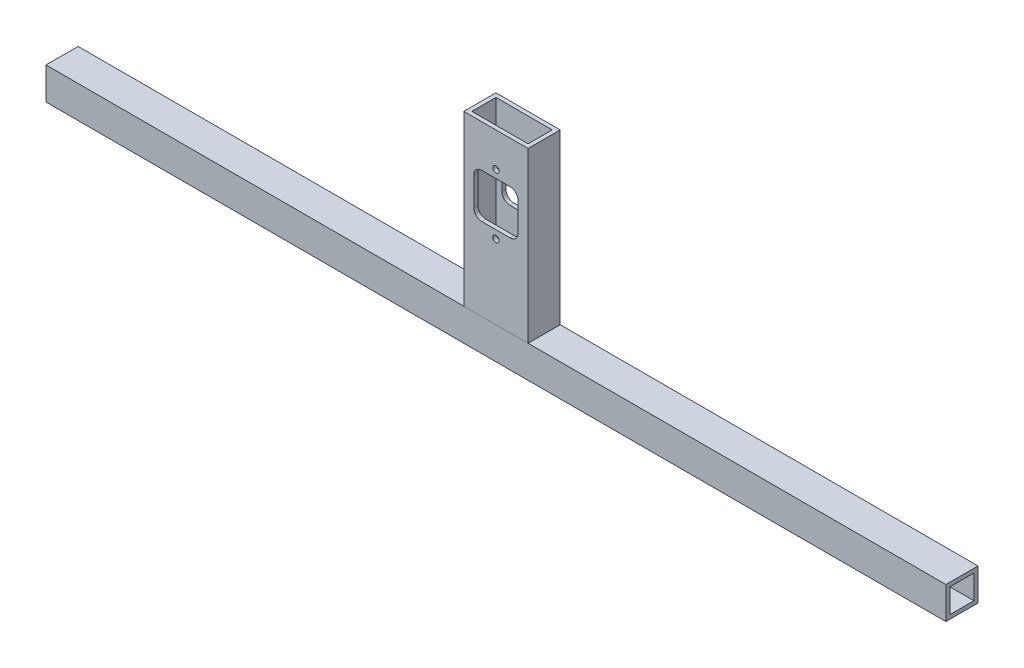
ISO-10303-21;
HEADER;
FILE_DESCRIPTION(('STEP AP214'),'2;1');
FILE_NAME('part.step','',(''),(''),'','','');
FILE_SCHEMA(('AUTOMOTIVE_DESIGN { 1 0 10303 214 1 1 1 1 }'));
ENDSEC;
DATA;
#1=APPLICATION_CONTEXT('core data for automotive mechanical design processes');
#2=APPLICATION_PROTOCOL_DEFINITION('international standard','automotive_design',2000,#1);
#3=PRODUCT_CONTEXT('',#1,'mechanical');
#4=PRODUCT('Part','Part','',(#3));
#5=PRODUCT_RELATED_PRODUCT_CATEGORY('part','',(#4));
#6=PRODUCT_DEFINITION_FORMATION('','',#4);
#7=PRODUCT_DEFINITION_CONTEXT('part definition',#1,'design');
#8=PRODUCT_DEFINITION('design','',#6,#7);
#9=PRODUCT_DEFINITION_SHAPE('','',#8);
#10=(LENGTH_UNIT() NAMED_UNIT(*) SI_UNIT(.MILLI.,.METRE.));
#11=(NAMED_UNIT(*) PLANE_ANGLE_UNIT() SI_UNIT($,.RADIAN.));
#12=(NAMED_UNIT(*) SI_UNIT($,.STERADIAN.) SOLID_ANGLE_UNIT());
#13=UNCERTAINTY_MEASURE_WITH_UNIT(LENGTH_MEASURE(1.E-05),#10,'distance_accuracy_value','');
#14=(GEOMETRIC_REPRESENTATION_CONTEXT(3) GLOBAL_UNCERTAINTY_ASSIGNED_CONTEXT((#13)) GLOBAL_UNIT_ASSIGNED_CONTEXT((#10,
#11,#12)) REPRESENTATION_CONTEXT('',''));
#15=CARTESIAN_POINT('',(0.,0.,0.));
#16=DIRECTION('',(0.,0.,1.));
#17=DIRECTION('',(1.,0.,0.));
#18=AXIS2_PLACEMENT_3D('',#15,#16,#17);
#19=CARTESIAN_POINT('',(-25.3999999999999,226.822,-25.4));
#20=DIRECTION('',(0.,1.,0.));
#21=DIRECTION('',(0.,0.,1.));
#22=AXIS2_PLACEMENT_3D('',#19,#20,#21);
#23=PLANE('',#22);
#24=DIRECTION('',(-1.,0.,0.));
#25=VECTOR('',#24,1.);
#26=CARTESIAN_POINT('',(-25.3999999999999,226.822,0.));
#27=LINE('',#26,#25);
#28=CARTESIAN_POINT('',(25.4000000000001,226.822,0.));
#29=VERTEX_POINT('',#28);
#30=CARTESIAN_POINT('',(-25.3999999999999,226.822,0.));
#31=VERTEX_POINT('',#30);
#32=EDGE_CURVE('E360',#29,#31,#27,.T.);
#33=ORIENTED_EDGE('',*,*,#32,.F.);
#34=DIRECTION('',(0.,0.,1.));
#35=VECTOR('',#34,1.);
#36=CARTESIAN_POINT('',(25.4000000000001,226.822,-25.4));
#37=LINE('',#36,#35);
#38=CARTESIAN_POINT('',(25.4000000000001,226.822,-25.4));
#39=VERTEX_POINT('',#38);
#40=EDGE_CURVE('E383',#39,#29,#37,.T.);
#41=ORIENTED_EDGE('',*,*,#40,.F.);
#42=DIRECTION('',(-1.,0.,0.));
#43=VECTOR('',#42,1.);
#44=CARTESIAN_POINT('',(-25.3999999999999,226.822,-25.4));
#45=LINE('',#44,#43);
#46=CARTESIAN_POINT('',(-25.3999999999999,226.822,-25.4));
#47=VERTEX_POINT('',#46);
#48=EDGE_CURVE('E366',#39,#47,#45,.T.);
#49=ORIENTED_EDGE('',*,*,#48,.T.);
#50=DIRECTION('',(0.,0.,1.));
#51=VECTOR('',#50,1.);
#52=CARTESIAN_POINT('',(-25.3999999999999,226.822,-25.4));
#53=LINE('',#52,#51);
#54=EDGE_CURVE('E380',#47,#31,#53,.T.);
#55=ORIENTED_EDGE('',*,*,#54,.T.);
#56=EDGE_LOOP('',(#33,#41,#49,#55));
#57=FACE_BOUND('',#56,.T.);
#58=DIRECTION('',(0.,0.,1.));
#59=VECTOR('',#58,1.);
#60=CARTESIAN_POINT('',(22.2250000000001,226.822,-25.4));
#61=LINE('',#60,#59);
#62=CARTESIAN_POINT('',(22.2250000000001,226.822,-22.225));
#63=VERTEX_POINT('',#62);
#64=CARTESIAN_POINT('',(22.2250000000001,226.822,-3.175));
#65=VERTEX_POINT('',#64);
#66=EDGE_CURVE('E342',#63,#65,#61,.T.);
#67=ORIENTED_EDGE('',*,*,#66,.T.);
#68=DIRECTION('',(-1.,0.,0.));
#69=VECTOR('',#68,1.);
#70=CARTESIAN_POINT('',(0.,226.822,-3.175));
#71=LINE('',#70,#69);
#72=CARTESIAN_POINT('',(-22.2249999999999,226.822,-3.175));
#73=VERTEX_POINT('',#72);
#74=EDGE_CURVE('E332',#65,#73,#71,.T.);
#75=ORIENTED_EDGE('',*,*,#74,.T.);
#76=DIRECTION('',(0.,0.,1.));
#77=VECTOR('',#76,1.);
#78=CARTESIAN_POINT('',(-22.2249999999999,226.822,-25.4));
#79=LINE('',#78,#77);
#80=CARTESIAN_POINT('',(-22.2249999999999,226.822,-22.225));
#81=VERTEX_POINT('',#80);
#82=EDGE_CURVE('E339',#81,#73,#79,.T.);
#83=ORIENTED_EDGE('',*,*,#82,.F.);
#84=DIRECTION('',(-1.,0.,0.));
#85=VECTOR('',#84,1.);
#86=CARTESIAN_POINT('',(0.,226.822,-22.225));
#87=LINE('',#86,#85);
#88=EDGE_CURVE('E336',#63,#81,#87,.T.);
#89=ORIENTED_EDGE('',*,*,#88,.F.);
#90=EDGE_LOOP('',(#67,#75,#83,#89));
#91=FACE_BOUND('',#90,.T.);
#92=ADVANCED_FACE('F47',(#57,#91),#23,.T.);
#93=CARTESIAN_POINT('',(-25.3999999999999,93.472,-25.4));
#94=DIRECTION('',(0.,-1.,0.));
#95=DIRECTION('',(0.,0.,-1.));
#96=AXIS2_PLACEMENT_3D('',#93,#94,#95);
#97=PLANE('',#96);
#98=DIRECTION('',(1.,0.,0.));
#99=VECTOR('',#98,1.);
#100=CARTESIAN_POINT('',(-25.3999999999999,93.472,0.));
#101=LINE('',#100,#99);
#102=CARTESIAN_POINT('',(-25.3999999999999,93.472,0.));
#103=VERTEX_POINT('',#102);
#104=CARTESIAN_POINT('',(25.4000000000001,93.472,0.));
#105=VERTEX_POINT('',#104);
#106=EDGE_CURVE('E372',#103,#105,#101,.T.);
#107=ORIENTED_EDGE('',*,*,#106,.F.);
#108=DIRECTION('',(0.,0.,1.));
#109=VECTOR('',#108,1.);
#110=CARTESIAN_POINT('',(-25.3999999999999,93.472,-25.4));
#111=LINE('',#110,#109);
#112=CARTESIAN_POINT('',(-25.3999999999999,93.472,-25.4));
#113=VERTEX_POINT('',#112);
#114=EDGE_CURVE('E369',#113,#103,#111,.T.);
#115=ORIENTED_EDGE('',*,*,#114,.F.);
#116=DIRECTION('',(1.,0.,0.));
#117=VECTOR('',#116,1.);
#118=CARTESIAN_POINT('',(-25.3999999999999,93.472,-25.4));
#119=LINE('',#118,#117);
#120=CARTESIAN_POINT('',(25.4000000000001,93.472,-25.4));
#121=VERTEX_POINT('',#120);
#122=EDGE_CURVE('E359',#113,#121,#119,.T.);
#123=ORIENTED_EDGE('',*,*,#122,.T.);
#124=DIRECTION('',(0.,0.,1.));
#125=VECTOR('',#124,1.);
#126=CARTESIAN_POINT('',(25.4000000000001,93.472,-25.4));
#127=LINE('',#126,#125);
#128=EDGE_CURVE('E385',#121,#105,#127,.T.);
#129=ORIENTED_EDGE('',*,*,#128,.T.);
#130=EDGE_LOOP('',(#107,#115,#123,#129));
#131=FACE_BOUND('',#130,.T.);
#132=DIRECTION('',(0.,0.,1.));
#133=VECTOR('',#132,1.);
#134=CARTESIAN_POINT('',(-22.2249999999999,93.472,-25.4));
#135=LINE('',#134,#133);
#136=CARTESIAN_POINT('',(-22.2249999999999,93.472,-22.225));
#137=VERTEX_POINT('',#136);
#138=CARTESIAN_POINT('',(-22.2249999999999,93.472,-3.175));
#139=VERTEX_POINT('',#138);
#140=EDGE_CURVE('E349',#137,#139,#135,.T.);
#141=ORIENTED_EDGE('',*,*,#140,.T.);
#142=DIRECTION('',(1.,0.,0.));
#143=VECTOR('',#142,1.);
#144=CARTESIAN_POINT('',(0.,93.472,-3.175));
#145=LINE('',#144,#143);
#146=CARTESIAN_POINT('',(22.2250000000001,93.472,-3.175));
#147=VERTEX_POINT('',#146);
#148=EDGE_CURVE('E327',#139,#147,#145,.T.);
#149=ORIENTED_EDGE('',*,*,#148,.T.);
#150=DIRECTION('',(0.,0.,1.));
#151=VECTOR('',#150,1.);
#152=CARTESIAN_POINT('',(22.2250000000001,93.472,-25.4));
#153=LINE('',#152,#151);
#154=CARTESIAN_POINT('',(22.2250000000001,93.472,-22.225));
#155=VERTEX_POINT('',#154);
#156=EDGE_CURVE('E347',#155,#147,#153,.T.);
#157=ORIENTED_EDGE('',*,*,#156,.F.);
#158=DIRECTION('',(1.,0.,0.));
#159=VECTOR('',#158,1.);
#160=CARTESIAN_POINT('',(0.,93.472,-22.225));
#161=LINE('',#160,#159);
#162=EDGE_CURVE('E331',#137,#155,#161,.T.);
#163=ORIENTED_EDGE('',*,*,#162,.F.);
#164=EDGE_LOOP('',(#141,#149,#157,#163));
#165=FACE_BOUND('',#164,.T.);
#166=ADVANCED_FACE('F432',(#131,#165),#97,.T.);
#167=CARTESIAN_POINT('',(-25.3999999999999,226.822,-25.4));
#168=DIRECTION('',(-1.,0.,0.));
#169=DIRECTION('',(0.,0.,1.));
#170=AXIS2_PLACEMENT_3D('',#167,#168,#169);
#171=PLANE('',#170);
#172=DIRECTION('',(0.,-1.,0.));
#173=VECTOR('',#172,1.);
#174=CARTESIAN_POINT('',(-25.3999999999999,226.822,0.));
#175=LINE('',#174,#173);
#176=EDGE_CURVE('E341',#31,#103,#175,.T.);
#177=ORIENTED_EDGE('',*,*,#176,.F.);
#178=ORIENTED_EDGE('',*,*,#54,.F.);
#179=DIRECTION('',(0.,-1.,0.));
#180=VECTOR('',#179,1.);
#181=CARTESIAN_POINT('',(-25.3999999999999,226.822,-25.4));
#182=LINE('',#181,#180);
#183=EDGE_CURVE('E356',#47,#113,#182,.T.);
#184=ORIENTED_EDGE('',*,*,#183,.T.);
#185=ORIENTED_EDGE('',*,*,#114,.T.);
#186=EDGE_LOOP('',(#177,#178,#184,#185));
#187=FACE_BOUND('',#186,.T.);
#188=ADVANCED_FACE('F49',(#187),#171,.T.);
#189=CARTESIAN_POINT('',(25.4000000000001,226.822,-25.4));
#190=DIRECTION('',(1.,0.,0.));
#191=DIRECTION('',(0.,0.,-1.));
#192=AXIS2_PLACEMENT_3D('',#189,#190,#191);
#193=PLANE('',#192);
#194=DIRECTION('',(0.,1.,0.));
#195=VECTOR('',#194,1.);
#196=CARTESIAN_POINT('',(25.4000000000001,226.822,0.));
#197=LINE('',#196,#195);
#198=EDGE_CURVE('E375',#105,#29,#197,.T.);
#199=ORIENTED_EDGE('',*,*,#198,.F.);
#200=ORIENTED_EDGE('',*,*,#128,.F.);
#201=DIRECTION('',(0.,1.,0.));
#202=VECTOR('',#201,1.);
#203=CARTESIAN_POINT('',(25.4000000000001,226.822,-25.4));
#204=LINE('',#203,#202);
#205=EDGE_CURVE('E363',#121,#39,#204,.T.);
#206=ORIENTED_EDGE('',*,*,#205,.T.);
#207=ORIENTED_EDGE('',*,*,#40,.T.);
#208=EDGE_LOOP('',(#199,#200,#206,#207));
#209=FACE_BOUND('',#208,.T.);
#210=ADVANCED_FACE('F445',(#209),#193,.T.);
#211=CARTESIAN_POINT('',(0.,0.,-25.4));
#212=DIRECTION('',(0.,0.,1.));
#213=DIRECTION('',(1.,0.,0.));
#214=AXIS2_PLACEMENT_3D('',#211,#212,#213);
#215=PLANE('',#214);
#216=CARTESIAN_POINT('',(-1.12831979130017E-13,152.2095,-25.4));
#217=DIRECTION('',(0.,0.,1.));
#218=DIRECTION('',(1.,0.,0.));
#219=AXIS2_PLACEMENT_3D('',#216,#217,#218);
#220=CIRCLE('',#219,2.48920000000001);
#221=CARTESIAN_POINT('',(2.48919999999989,152.2095,-25.4));
#222=VERTEX_POINT('',#221);
#223=EDGE_CURVE('E545',#222,#222,#220,.T.);
#224=ORIENTED_EDGE('',*,*,#223,.T.);
#225=EDGE_LOOP('',(#224));
#226=FACE_BOUND('',#225,.T.);
#227=CARTESIAN_POINT('',(1.11022302462516E-13,199.8345,-25.4));
#228=DIRECTION('',(0.,0.,1.));
#229=DIRECTION('',(1.,0.,0.));
#230=AXIS2_PLACEMENT_3D('',#227,#228,#229);
#231=CIRCLE('',#230,2.48920000000001);
#232=CARTESIAN_POINT('',(2.48920000000012,199.8345,-25.4));
#233=VERTEX_POINT('',#232);
#234=EDGE_CURVE('E261',#233,#233,#231,.T.);
#235=ORIENTED_EDGE('',*,*,#234,.T.);
#236=EDGE_LOOP('',(#235));
#237=FACE_BOUND('',#236,.T.);
#238=DIRECTION('',(0.,1.,0.));
#239=VECTOR('',#238,1.);
#240=CARTESIAN_POINT('',(17.5006,164.8714,-25.4));
#241=LINE('',#240,#239);
#242=CARTESIAN_POINT('',(17.5006,164.8714,-25.4));
#243=VERTEX_POINT('',#242);
#244=CARTESIAN_POINT('',(17.5006,187.1726,-25.4));
#245=VERTEX_POINT('',#244);
#246=EDGE_CURVE('E236',#243,#245,#241,.T.);
#247=ORIENTED_EDGE('',*,*,#246,.T.);
#248=CARTESIAN_POINT('',(11.1506,187.1726,-25.4));
#249=DIRECTION('',(0.,0.,1.));
#250=DIRECTION('',(-1.,0.,0.));
#251=AXIS2_PLACEMENT_3D('',#248,#249,#250);
#252=CIRCLE('',#251,6.35);
#253=CARTESIAN_POINT('',(11.1505999999999,193.5226,-25.4));
#254=VERTEX_POINT('',#253);
#255=EDGE_CURVE('E217',#245,#254,#252,.T.);
#256=ORIENTED_EDGE('',*,*,#255,.T.);
#257=DIRECTION('',(-1.,0.,0.));
#258=VECTOR('',#257,1.);
#259=CARTESIAN_POINT('',(-11.1506,193.5226,-25.4));
#260=LINE('',#259,#258);
#261=CARTESIAN_POINT('',(-11.1506,193.5226,-25.4));
#262=VERTEX_POINT('',#261);
#263=EDGE_CURVE('E227',#254,#262,#260,.T.);
#264=ORIENTED_EDGE('',*,*,#263,.T.);
#265=CARTESIAN_POINT('',(-11.1506,187.1726,-25.4));
#266=DIRECTION('',(0.,0.,1.));
#267=DIRECTION('',(-1.,0.,0.));
#268=AXIS2_PLACEMENT_3D('',#265,#266,#267);
#269=CIRCLE('',#268,6.35);
#270=CARTESIAN_POINT('',(-17.5006,187.1726,-25.4));
#271=VERTEX_POINT('',#270);
#272=EDGE_CURVE('E64',#262,#271,#269,.T.);
#273=ORIENTED_EDGE('',*,*,#272,.T.);
#274=DIRECTION('',(0.,-1.,0.));
#275=VECTOR('',#274,1.);
#276=CARTESIAN_POINT('',(-17.5006,164.8714,-25.4));
#277=LINE('',#276,#275);
#278=CARTESIAN_POINT('',(-17.5006,164.8714,-25.4));
#279=VERTEX_POINT('',#278);
#280=EDGE_CURVE('E247',#271,#279,#277,.T.);
#281=ORIENTED_EDGE('',*,*,#280,.T.);
#282=CARTESIAN_POINT('',(-11.1506,164.8714,-25.4));
#283=DIRECTION('',(0.,0.,1.));
#284=DIRECTION('',(-1.,0.,0.));
#285=AXIS2_PLACEMENT_3D('',#282,#283,#284);
#286=CIRCLE('',#285,6.35);
#287=CARTESIAN_POINT('',(-11.1506,158.5214,-25.4));
#288=VERTEX_POINT('',#287);
#289=EDGE_CURVE('E250',#279,#288,#286,.T.);
#290=ORIENTED_EDGE('',*,*,#289,.T.);
#291=DIRECTION('',(1.,0.,0.));
#292=VECTOR('',#291,1.);
#293=CARTESIAN_POINT('',(-11.1506,158.5214,-25.4));
#294=LINE('',#293,#292);
#295=CARTESIAN_POINT('',(11.1505999999999,158.5214,-25.4));
#296=VERTEX_POINT('',#295);
#297=EDGE_CURVE('E253',#288,#296,#294,.T.);
#298=ORIENTED_EDGE('',*,*,#297,.T.);
#299=CARTESIAN_POINT('',(11.1506,164.8714,-25.4));
#300=DIRECTION('',(0.,0.,1.));
#301=DIRECTION('',(1.,0.,0.));
#302=AXIS2_PLACEMENT_3D('',#299,#300,#301);
#303=CIRCLE('',#302,6.35);
#304=EDGE_CURVE('E256',#296,#243,#303,.T.);
#305=ORIENTED_EDGE('',*,*,#304,.T.);
#306=EDGE_LOOP('',(#247,#256,#264,#273,#281,#290,#298,#305));
#307=FACE_BOUND('',#306,.T.);
#308=ORIENTED_EDGE('',*,*,#183,.F.);
#309=ORIENTED_EDGE('',*,*,#48,.F.);
#310=ORIENTED_EDGE('',*,*,#205,.F.);
#311=ORIENTED_EDGE('',*,*,#122,.F.);
#312=EDGE_LOOP('',(#308,#309,#310,#311));
#313=FACE_BOUND('',#312,.T.);
#314=ADVANCED_FACE('F232',(#226,#237,#307,#313),#215,.F.);
#315=CARTESIAN_POINT('',(0.,0.,0.));
#316=DIRECTION('',(0.,0.,1.));
#317=DIRECTION('',(1.,0.,0.));
#318=AXIS2_PLACEMENT_3D('',#315,#316,#317);
#319=PLANE('',#318);
#320=CARTESIAN_POINT('',(-1.12831979130017E-13,152.2095,0.));
#321=DIRECTION('',(0.,0.,1.));
#322=DIRECTION('',(1.,0.,0.));
#323=AXIS2_PLACEMENT_3D('',#320,#321,#322);
#324=CIRCLE('',#323,2.48920000000001);
#325=CARTESIAN_POINT('',(2.48919999999989,152.2095,0.));
#326=VERTEX_POINT('',#325);
#327=EDGE_CURVE('E243',#326,#326,#324,.T.);
#328=ORIENTED_EDGE('',*,*,#327,.F.);
#329=EDGE_LOOP('',(#328));
#330=FACE_BOUND('',#329,.T.);
#331=CARTESIAN_POINT('',(1.11022302462516E-13,199.8345,0.));
#332=DIRECTION('',(0.,0.,1.));
#333=DIRECTION('',(1.,0.,0.));
#334=AXIS2_PLACEMENT_3D('',#331,#332,#333);
#335=CIRCLE('',#334,2.48920000000001);
#336=CARTESIAN_POINT('',(2.48920000000012,199.8345,0.));
#337=VERTEX_POINT('',#336);
#338=EDGE_CURVE('E546',#337,#337,#335,.T.);
#339=ORIENTED_EDGE('',*,*,#338,.F.);
#340=EDGE_LOOP('',(#339));
#341=FACE_BOUND('',#340,.T.);
#342=CARTESIAN_POINT('',(11.1506,187.1726,0.));
#343=DIRECTION('',(0.,0.,1.));
#344=DIRECTION('',(-1.,0.,0.));
#345=AXIS2_PLACEMENT_3D('',#342,#343,#344);
#346=CIRCLE('',#345,6.35);
#347=CARTESIAN_POINT('',(17.5006,187.1726,0.));
#348=VERTEX_POINT('',#347);
#349=CARTESIAN_POINT('',(11.1505999999999,193.5226,0.));
#350=VERTEX_POINT('',#349);
#351=EDGE_CURVE('E72',#348,#350,#346,.T.);
#352=ORIENTED_EDGE('',*,*,#351,.F.);
#353=DIRECTION('',(0.,1.,0.));
#354=VECTOR('',#353,1.);
#355=CARTESIAN_POINT('',(17.5006,164.8714,0.));
#356=LINE('',#355,#354);
#357=CARTESIAN_POINT('',(17.5006,164.8714,0.));
#358=VERTEX_POINT('',#357);
#359=EDGE_CURVE('E237',#358,#348,#356,.T.);
#360=ORIENTED_EDGE('',*,*,#359,.F.);
#361=CARTESIAN_POINT('',(11.1506,164.8714,0.));
#362=DIRECTION('',(0.,0.,1.));
#363=DIRECTION('',(1.,0.,0.));
#364=AXIS2_PLACEMENT_3D('',#361,#362,#363);
#365=CIRCLE('',#364,6.35);
#366=CARTESIAN_POINT('',(11.1505999999999,158.5214,0.));
#367=VERTEX_POINT('',#366);
#368=EDGE_CURVE('E240',#367,#358,#365,.T.);
#369=ORIENTED_EDGE('',*,*,#368,.F.);
#370=DIRECTION('',(1.,0.,0.));
#371=VECTOR('',#370,1.);
#372=CARTESIAN_POINT('',(-11.1506,158.5214,0.));
#373=LINE('',#372,#371);
#374=CARTESIAN_POINT('',(-11.1506,158.5214,0.));
#375=VERTEX_POINT('',#374);
#376=EDGE_CURVE('E273',#375,#367,#373,.T.);
#377=ORIENTED_EDGE('',*,*,#376,.F.);
#378=CARTESIAN_POINT('',(-11.1506,164.8714,0.));
#379=DIRECTION('',(0.,0.,1.));
#380=DIRECTION('',(-1.,0.,0.));
#381=AXIS2_PLACEMENT_3D('',#378,#379,#380);
#382=CIRCLE('',#381,6.35);
#383=CARTESIAN_POINT('',(-17.5006,164.8714,0.));
#384=VERTEX_POINT('',#383);
#385=EDGE_CURVE('E270',#384,#375,#382,.T.);
#386=ORIENTED_EDGE('',*,*,#385,.F.);
#387=DIRECTION('',(0.,-1.,0.));
#388=VECTOR('',#387,1.);
#389=CARTESIAN_POINT('',(-17.5006,164.8714,0.));
#390=LINE('',#389,#388);
#391=CARTESIAN_POINT('',(-17.5006,187.1726,0.));
#392=VERTEX_POINT('',#391);
#393=EDGE_CURVE('E267',#392,#384,#390,.T.);
#394=ORIENTED_EDGE('',*,*,#393,.F.);
#395=CARTESIAN_POINT('',(-11.1506,187.1726,0.));
#396=DIRECTION('',(0.,0.,1.));
#397=DIRECTION('',(-1.,0.,0.));
#398=AXIS2_PLACEMENT_3D('',#395,#396,#397);
#399=CIRCLE('',#398,6.35);
#400=CARTESIAN_POINT('',(-11.1506,193.5226,0.));
#401=VERTEX_POINT('',#400);
#402=EDGE_CURVE('E264',#401,#392,#399,.T.);
#403=ORIENTED_EDGE('',*,*,#402,.F.);
#404=DIRECTION('',(-1.,0.,0.));
#405=VECTOR('',#404,1.);
#406=CARTESIAN_POINT('',(-11.1506,193.5226,0.));
#407=LINE('',#406,#405);
#408=EDGE_CURVE('E260',#350,#401,#407,.T.);
#409=ORIENTED_EDGE('',*,*,#408,.F.);
#410=EDGE_LOOP('',(#352,#360,#369,#377,#386,#394,#403,#409));
#411=FACE_BOUND('',#410,.T.);
#412=ORIENTED_EDGE('',*,*,#176,.T.);
#413=ORIENTED_EDGE('',*,*,#106,.T.);
#414=ORIENTED_EDGE('',*,*,#198,.T.);
#415=ORIENTED_EDGE('',*,*,#32,.T.);
#416=EDGE_LOOP('',(#412,#413,#414,#415));
#417=FACE_BOUND('',#416,.T.);
#418=ADVANCED_FACE('F443',(#330,#341,#411,#417),#319,.T.);
#419=CARTESIAN_POINT('',(-22.2249999999999,226.822,-25.4));
#420=DIRECTION('',(-1.,0.,0.));
#421=DIRECTION('',(0.,0.,1.));
#422=AXIS2_PLACEMENT_3D('',#419,#420,#421);
#423=PLANE('',#422);
#424=DIRECTION('',(0.,-1.,0.));
#425=VECTOR('',#424,1.);
#426=CARTESIAN_POINT('',(-22.2249999999999,0.,-3.175));
#427=LINE('',#426,#425);
#428=EDGE_CURVE('E324',#73,#139,#427,.T.);
#429=ORIENTED_EDGE('',*,*,#428,.T.);
#430=ORIENTED_EDGE('',*,*,#140,.F.);
#431=DIRECTION('',(0.,-1.,0.));
#432=VECTOR('',#431,1.);
#433=CARTESIAN_POINT('',(-22.2249999999999,0.,-22.225));
#434=LINE('',#433,#432);
#435=EDGE_CURVE('E328',#81,#137,#434,.T.);
#436=ORIENTED_EDGE('',*,*,#435,.F.);
#437=ORIENTED_EDGE('',*,*,#82,.T.);
#438=EDGE_LOOP('',(#429,#430,#436,#437));
#439=FACE_BOUND('',#438,.T.);
#440=ADVANCED_FACE('F467',(#439),#423,.F.);
#441=CARTESIAN_POINT('',(22.2250000000001,226.822,-25.4));
#442=DIRECTION('',(1.,0.,0.));
#443=DIRECTION('',(0.,0.,-1.));
#444=AXIS2_PLACEMENT_3D('',#441,#442,#443);
#445=PLANE('',#444);
#446=DIRECTION('',(0.,1.,0.));
#447=VECTOR('',#446,1.);
#448=CARTESIAN_POINT('',(22.2250000000001,0.,-3.175));
#449=LINE('',#448,#447);
#450=EDGE_CURVE('E337',#147,#65,#449,.T.);
#451=ORIENTED_EDGE('',*,*,#450,.T.);
#452=ORIENTED_EDGE('',*,*,#66,.F.);
#453=DIRECTION('',(0.,1.,0.));
#454=VECTOR('',#453,1.);
#455=CARTESIAN_POINT('',(22.2250000000001,0.,-22.225));
#456=LINE('',#455,#454);
#457=EDGE_CURVE('E333',#155,#63,#456,.T.);
#458=ORIENTED_EDGE('',*,*,#457,.F.);
#459=ORIENTED_EDGE('',*,*,#156,.T.);
#460=EDGE_LOOP('',(#451,#452,#458,#459));
#461=FACE_BOUND('',#460,.T.);
#462=ADVANCED_FACE('F478',(#461),#445,.F.);
#463=CARTESIAN_POINT('',(0.,0.,-22.225));
#464=DIRECTION('',(0.,0.,1.));
#465=DIRECTION('',(1.,0.,0.));
#466=AXIS2_PLACEMENT_3D('',#463,#464,#465);
#467=PLANE('',#466);
#468=CARTESIAN_POINT('',(-1.12831979130017E-13,152.2095,-22.225));
#469=DIRECTION('',(0.,0.,1.));
#470=DIRECTION('',(1.,0.,0.));
#471=AXIS2_PLACEMENT_3D('',#468,#469,#470);
#472=CIRCLE('',#471,2.48920000000001);
#473=CARTESIAN_POINT('',(2.48919999999989,152.2095,-22.225));
#474=VERTEX_POINT('',#473);
#475=EDGE_CURVE('E321',#474,#474,#472,.T.);
#476=ORIENTED_EDGE('',*,*,#475,.F.);
#477=EDGE_LOOP('',(#476));
#478=FACE_BOUND('',#477,.T.);
#479=CARTESIAN_POINT('',(1.11022302462516E-13,199.8345,-22.225));
#480=DIRECTION('',(0.,0.,1.));
#481=DIRECTION('',(1.,0.,0.));
#482=AXIS2_PLACEMENT_3D('',#479,#480,#481);
#483=CIRCLE('',#482,2.48920000000001);
#484=CARTESIAN_POINT('',(2.48920000000012,199.8345,-22.225));
#485=VERTEX_POINT('',#484);
#486=EDGE_CURVE('E318',#485,#485,#483,.T.);
#487=ORIENTED_EDGE('',*,*,#486,.F.);
#488=EDGE_LOOP('',(#487));
#489=FACE_BOUND('',#488,.T.);
#490=CARTESIAN_POINT('',(11.1506,187.1726,-22.225));
#491=DIRECTION('',(0.,0.,1.));
#492=DIRECTION('',(1.,0.,0.));
#493=AXIS2_PLACEMENT_3D('',#490,#491,#492);
#494=CIRCLE('',#493,6.35);
#495=CARTESIAN_POINT('',(17.5006,187.1726,-22.225));
#496=VERTEX_POINT('',#495);
#497=CARTESIAN_POINT('',(11.1505999999999,193.5226,-22.225));
#498=VERTEX_POINT('',#497);
#499=EDGE_CURVE('E220',#496,#498,#494,.T.);
#500=ORIENTED_EDGE('',*,*,#499,.F.);
#501=DIRECTION('',(0.,1.,0.));
#502=VECTOR('',#501,1.);
#503=CARTESIAN_POINT('',(17.5006,0.,-22.225));
#504=LINE('',#503,#502);
#505=CARTESIAN_POINT('',(17.5006,164.8714,-22.225));
#506=VERTEX_POINT('',#505);
#507=EDGE_CURVE('E314',#506,#496,#504,.T.);
#508=ORIENTED_EDGE('',*,*,#507,.F.);
#509=CARTESIAN_POINT('',(11.1506,164.8714,-22.225));
#510=DIRECTION('',(0.,0.,1.));
#511=DIRECTION('',(1.,0.,0.));
#512=AXIS2_PLACEMENT_3D('',#509,#510,#511);
#513=CIRCLE('',#512,6.35);
#514=CARTESIAN_POINT('',(11.1505999999999,158.5214,-22.225));
#515=VERTEX_POINT('',#514);
#516=EDGE_CURVE('E312',#515,#506,#513,.T.);
#517=ORIENTED_EDGE('',*,*,#516,.F.);
#518=DIRECTION('',(1.,0.,0.));
#519=VECTOR('',#518,1.);
#520=CARTESIAN_POINT('',(0.,158.5214,-22.225));
#521=LINE('',#520,#519);
#522=CARTESIAN_POINT('',(-11.1506,158.5214,-22.225));
#523=VERTEX_POINT('',#522);
#524=EDGE_CURVE('E310',#523,#515,#521,.T.);
#525=ORIENTED_EDGE('',*,*,#524,.F.);
#526=CARTESIAN_POINT('',(-11.1506,164.8714,-22.225));
#527=DIRECTION('',(0.,0.,1.));
#528=DIRECTION('',(1.,0.,0.));
#529=AXIS2_PLACEMENT_3D('',#526,#527,#528);
#530=CIRCLE('',#529,6.35);
#531=CARTESIAN_POINT('',(-17.5006,164.8714,-22.225));
#532=VERTEX_POINT('',#531);
#533=EDGE_CURVE('E308',#532,#523,#530,.T.);
#534=ORIENTED_EDGE('',*,*,#533,.F.);
#535=DIRECTION('',(0.,-1.,0.));
#536=VECTOR('',#535,1.);
#537=CARTESIAN_POINT('',(-17.5006,0.,-22.225));
#538=LINE('',#537,#536);
#539=CARTESIAN_POINT('',(-17.5006,187.1726,-22.225));
#540=VERTEX_POINT('',#539);
#541=EDGE_CURVE('E306',#540,#532,#538,.T.);
#542=ORIENTED_EDGE('',*,*,#541,.F.);
#543=CARTESIAN_POINT('',(-11.1506,187.1726,-22.225));
#544=DIRECTION('',(0.,0.,1.));
#545=DIRECTION('',(1.,0.,0.));
#546=AXIS2_PLACEMENT_3D('',#543,#544,#545);
#547=CIRCLE('',#546,6.35);
#548=CARTESIAN_POINT('',(-11.1506,193.5226,-22.225));
#549=VERTEX_POINT('',#548);
#550=EDGE_CURVE('E304',#549,#540,#547,.T.);
#551=ORIENTED_EDGE('',*,*,#550,.F.);
#552=DIRECTION('',(-1.,0.,0.));
#553=VECTOR('',#552,1.);
#554=CARTESIAN_POINT('',(0.,193.5226,-22.225));
#555=LINE('',#554,#553);
#556=EDGE_CURVE('E280',#498,#549,#555,.T.);
#557=ORIENTED_EDGE('',*,*,#556,.F.);
#558=EDGE_LOOP('',(#500,#508,#517,#525,#534,#542,#551,#557));
#559=FACE_BOUND('',#558,.T.);
#560=ORIENTED_EDGE('',*,*,#435,.T.);
#561=ORIENTED_EDGE('',*,*,#162,.T.);
#562=ORIENTED_EDGE('',*,*,#457,.T.);
#563=ORIENTED_EDGE('',*,*,#88,.T.);
#564=EDGE_LOOP('',(#560,#561,#562,#563));
#565=FACE_BOUND('',#564,.T.);
#566=ADVANCED_FACE('F471',(#478,#489,#559,#565),#467,.T.);
#567=CARTESIAN_POINT('',(0.,0.,-3.175));
#568=DIRECTION('',(0.,0.,1.));
#569=DIRECTION('',(1.,0.,0.));
#570=AXIS2_PLACEMENT_3D('',#567,#568,#569);
#571=PLANE('',#570);
#572=CARTESIAN_POINT('',(-1.12831979130017E-13,152.2095,-3.175));
#573=DIRECTION('',(0.,0.,1.));
#574=DIRECTION('',(1.,0.,0.));
#575=AXIS2_PLACEMENT_3D('',#572,#573,#574);
#576=CIRCLE('',#575,2.48920000000001);
#577=CARTESIAN_POINT('',(2.48919999999989,152.2095,-3.175));
#578=VERTEX_POINT('',#577);
#579=EDGE_CURVE('E51',#578,#578,#576,.T.);
#580=ORIENTED_EDGE('',*,*,#579,.T.);
#581=EDGE_LOOP('',(#580));
#582=FACE_BOUND('',#581,.T.);
#583=CARTESIAN_POINT('',(1.11022302462516E-13,199.8345,-3.175));
#584=DIRECTION('',(0.,0.,1.));
#585=DIRECTION('',(1.,0.,0.));
#586=AXIS2_PLACEMENT_3D('',#583,#584,#585);
#587=CIRCLE('',#586,2.48920000000001);
#588=CARTESIAN_POINT('',(2.48920000000012,199.8345,-3.175));
#589=VERTEX_POINT('',#588);
#590=EDGE_CURVE('E317',#589,#589,#587,.T.);
#591=ORIENTED_EDGE('',*,*,#590,.T.);
#592=EDGE_LOOP('',(#591));
#593=FACE_BOUND('',#592,.T.);
#594=DIRECTION('',(0.,1.,0.));
#595=VECTOR('',#594,1.);
#596=CARTESIAN_POINT('',(17.5006,0.,-3.175));
#597=LINE('',#596,#595);
#598=CARTESIAN_POINT('',(17.5006,164.8714,-3.175));
#599=VERTEX_POINT('',#598);
#600=CARTESIAN_POINT('',(17.5006,187.1726,-3.175));
#601=VERTEX_POINT('',#600);
#602=EDGE_CURVE('E56',#599,#601,#597,.T.);
#603=ORIENTED_EDGE('',*,*,#602,.T.);
#604=CARTESIAN_POINT('',(11.1506,187.1726,-3.175));
#605=DIRECTION('',(0.,0.,1.));
#606=DIRECTION('',(1.,0.,0.));
#607=AXIS2_PLACEMENT_3D('',#604,#605,#606);
#608=CIRCLE('',#607,6.35);
#609=CARTESIAN_POINT('',(11.1505999999999,193.5226,-3.175));
#610=VERTEX_POINT('',#609);
#611=EDGE_CURVE('E12',#601,#610,#608,.T.);
#612=ORIENTED_EDGE('',*,*,#611,.T.);
#613=DIRECTION('',(-1.,0.,0.));
#614=VECTOR('',#613,1.);
#615=CARTESIAN_POINT('',(0.,193.5226,-3.175));
#616=LINE('',#615,#614);
#617=CARTESIAN_POINT('',(-11.1506,193.5226,-3.175));
#618=VERTEX_POINT('',#617);
#619=EDGE_CURVE('E382',#610,#618,#616,.T.);
#620=ORIENTED_EDGE('',*,*,#619,.T.);
#621=CARTESIAN_POINT('',(-11.1506,187.1726,-3.175));
#622=DIRECTION('',(0.,0.,1.));
#623=DIRECTION('',(1.,0.,0.));
#624=AXIS2_PLACEMENT_3D('',#621,#622,#623);
#625=CIRCLE('',#624,6.35);
#626=CARTESIAN_POINT('',(-17.5006,187.1726,-3.175));
#627=VERTEX_POINT('',#626);
#628=EDGE_CURVE('E390',#618,#627,#625,.T.);
#629=ORIENTED_EDGE('',*,*,#628,.T.);
#630=DIRECTION('',(0.,-1.,0.));
#631=VECTOR('',#630,1.);
#632=CARTESIAN_POINT('',(-17.5006,0.,-3.175));
#633=LINE('',#632,#631);
#634=CARTESIAN_POINT('',(-17.5006,164.8714,-3.175));
#635=VERTEX_POINT('',#634);
#636=EDGE_CURVE('E393',#627,#635,#633,.T.);
#637=ORIENTED_EDGE('',*,*,#636,.T.);
#638=CARTESIAN_POINT('',(-11.1506,164.8714,-3.175));
#639=DIRECTION('',(0.,0.,1.));
#640=DIRECTION('',(1.,0.,0.));
#641=AXIS2_PLACEMENT_3D('',#638,#639,#640);
#642=CIRCLE('',#641,6.35);
#643=CARTESIAN_POINT('',(-11.1506,158.5214,-3.175));
#644=VERTEX_POINT('',#643);
#645=EDGE_CURVE('E396',#635,#644,#642,.T.);
#646=ORIENTED_EDGE('',*,*,#645,.T.);
#647=DIRECTION('',(1.,0.,0.));
#648=VECTOR('',#647,1.);
#649=CARTESIAN_POINT('',(0.,158.5214,-3.175));
#650=LINE('',#649,#648);
#651=CARTESIAN_POINT('',(11.1505999999999,158.5214,-3.175));
#652=VERTEX_POINT('',#651);
#653=EDGE_CURVE('E399',#644,#652,#650,.T.);
#654=ORIENTED_EDGE('',*,*,#653,.T.);
#655=CARTESIAN_POINT('',(11.1506,164.8714,-3.175));
#656=DIRECTION('',(0.,0.,1.));
#657=DIRECTION('',(1.,0.,0.));
#658=AXIS2_PLACEMENT_3D('',#655,#656,#657);
#659=CIRCLE('',#658,6.35);
#660=EDGE_CURVE('E402',#652,#599,#659,.T.);
#661=ORIENTED_EDGE('',*,*,#660,.T.);
#662=EDGE_LOOP('',(#603,#612,#620,#629,#637,#646,#654,#661));
#663=FACE_BOUND('',#662,.T.);
#664=ORIENTED_EDGE('',*,*,#428,.F.);
#665=ORIENTED_EDGE('',*,*,#74,.F.);
#666=ORIENTED_EDGE('',*,*,#450,.F.);
#667=ORIENTED_EDGE('',*,*,#148,.F.);
#668=EDGE_LOOP('',(#664,#665,#666,#667));
#669=FACE_BOUND('',#668,.T.);
#670=ADVANCED_FACE('F409',(#582,#593,#663,#669),#571,.F.);
#671=CARTESIAN_POINT('',(-11.1506,193.5226,-25.4));
#672=DIRECTION('',(0.,1.,0.));
#673=DIRECTION('',(0.,0.,1.));
#674=AXIS2_PLACEMENT_3D('',#671,#672,#673);
#675=PLANE('',#674);
#676=DIRECTION('',(0.,0.,1.));
#677=VECTOR('',#676,1.);
#678=CARTESIAN_POINT('',(11.1505999999999,193.5226,-25.4));
#679=LINE('',#678,#677);
#680=EDGE_CURVE('E224',#610,#350,#679,.T.);
#681=ORIENTED_EDGE('',*,*,#680,.T.);
#682=ORIENTED_EDGE('',*,*,#408,.T.);
#683=DIRECTION('',(0.,0.,1.));
#684=VECTOR('',#683,1.);
#685=CARTESIAN_POINT('',(-11.1506,193.5226,-25.4));
#686=LINE('',#685,#684);
#687=EDGE_CURVE('E223',#618,#401,#686,.T.);
#688=ORIENTED_EDGE('',*,*,#687,.F.);
#689=ORIENTED_EDGE('',*,*,#619,.F.);
#690=EDGE_LOOP('',(#681,#682,#688,#689));
#691=FACE_BOUND('',#690,.T.);
#692=ADVANCED_FACE('F490',(#691),#675,.F.);
#693=CARTESIAN_POINT('',(-11.1506,187.1726,-25.4));
#694=DIRECTION('',(0.,0.,1.));
#695=DIRECTION('',(1.,0.,0.));
#696=AXIS2_PLACEMENT_3D('',#693,#694,#695);
#697=CYLINDRICAL_SURFACE('',#696,6.35);
#698=ORIENTED_EDGE('',*,*,#687,.T.);
#699=ORIENTED_EDGE('',*,*,#402,.T.);
#700=DIRECTION('',(0.,0.,1.));
#701=VECTOR('',#700,1.);
#702=CARTESIAN_POINT('',(-17.5006,187.1726,-25.4));
#703=LINE('',#702,#701);
#704=EDGE_CURVE('E301',#627,#392,#703,.T.);
#705=ORIENTED_EDGE('',*,*,#704,.F.);
#706=ORIENTED_EDGE('',*,*,#628,.F.);
#707=EDGE_LOOP('',(#698,#699,#705,#706));
#708=FACE_BOUND('',#707,.T.);
#709=ADVANCED_FACE('F495',(#708),#697,.F.);
#710=CARTESIAN_POINT('',(-17.5006,164.8714,-25.4));
#711=DIRECTION('',(-1.,0.,0.));
#712=DIRECTION('',(0.,0.,1.));
#713=AXIS2_PLACEMENT_3D('',#710,#711,#712);
#714=PLANE('',#713);
#715=ORIENTED_EDGE('',*,*,#704,.T.);
#716=ORIENTED_EDGE('',*,*,#393,.T.);
#717=DIRECTION('',(0.,0.,1.));
#718=VECTOR('',#717,1.);
#719=CARTESIAN_POINT('',(-17.5006,164.8714,-25.4));
#720=LINE('',#719,#718);
#721=EDGE_CURVE('E297',#635,#384,#720,.T.);
#722=ORIENTED_EDGE('',*,*,#721,.F.);
#723=ORIENTED_EDGE('',*,*,#636,.F.);
#724=EDGE_LOOP('',(#715,#716,#722,#723));
#725=FACE_BOUND('',#724,.T.);
#726=ADVANCED_FACE('F504',(#725),#714,.F.);
#727=CARTESIAN_POINT('',(-11.1506,164.8714,-25.4));
#728=DIRECTION('',(0.,0.,1.));
#729=DIRECTION('',(1.,0.,0.));
#730=AXIS2_PLACEMENT_3D('',#727,#728,#729);
#731=CYLINDRICAL_SURFACE('',#730,6.35);
#732=ORIENTED_EDGE('',*,*,#721,.T.);
#733=ORIENTED_EDGE('',*,*,#385,.T.);
#734=DIRECTION('',(0.,0.,1.));
#735=VECTOR('',#734,1.);
#736=CARTESIAN_POINT('',(-11.1506,158.5214,-25.4));
#737=LINE('',#736,#735);
#738=EDGE_CURVE('E293',#644,#375,#737,.T.);
#739=ORIENTED_EDGE('',*,*,#738,.F.);
#740=ORIENTED_EDGE('',*,*,#645,.F.);
#741=EDGE_LOOP('',(#732,#733,#739,#740));
#742=FACE_BOUND('',#741,.T.);
#743=ADVANCED_FACE('F524',(#742),#731,.F.);
#744=CARTESIAN_POINT('',(-11.1506,158.5214,-25.4));
#745=DIRECTION('',(0.,-1.,0.));
#746=DIRECTION('',(0.,0.,-1.));
#747=AXIS2_PLACEMENT_3D('',#744,#745,#746);
#748=PLANE('',#747);
#749=ORIENTED_EDGE('',*,*,#738,.T.);
#750=ORIENTED_EDGE('',*,*,#376,.T.);
#751=DIRECTION('',(0.,0.,1.));
#752=VECTOR('',#751,1.);
#753=CARTESIAN_POINT('',(11.1505999999999,158.5214,-25.4));
#754=LINE('',#753,#752);
#755=EDGE_CURVE('E289',#652,#367,#754,.T.);
#756=ORIENTED_EDGE('',*,*,#755,.F.);
#757=ORIENTED_EDGE('',*,*,#653,.F.);
#758=EDGE_LOOP('',(#749,#750,#756,#757));
#759=FACE_BOUND('',#758,.T.);
#760=ADVANCED_FACE('F529',(#759),#748,.F.);
#761=CARTESIAN_POINT('',(11.1506,164.8714,-25.4));
#762=DIRECTION('',(0.,0.,1.));
#763=DIRECTION('',(1.,0.,0.));
#764=AXIS2_PLACEMENT_3D('',#761,#762,#763);
#765=CYLINDRICAL_SURFACE('',#764,6.35);
#766=ORIENTED_EDGE('',*,*,#755,.T.);
#767=ORIENTED_EDGE('',*,*,#368,.T.);
#768=DIRECTION('',(0.,0.,1.));
#769=VECTOR('',#768,1.);
#770=CARTESIAN_POINT('',(17.5006,164.8714,-25.4));
#771=LINE('',#770,#769);
#772=EDGE_CURVE('E285',#599,#358,#771,.T.);
#773=ORIENTED_EDGE('',*,*,#772,.F.);
#774=ORIENTED_EDGE('',*,*,#660,.F.);
#775=EDGE_LOOP('',(#766,#767,#773,#774));
#776=FACE_BOUND('',#775,.T.);
#777=ADVANCED_FACE('F534',(#776),#765,.F.);
#778=CARTESIAN_POINT('',(17.5006,164.8714,-25.4));
#779=DIRECTION('',(1.,0.,0.));
#780=DIRECTION('',(0.,0.,-1.));
#781=AXIS2_PLACEMENT_3D('',#778,#779,#780);
#782=PLANE('',#781);
#783=ORIENTED_EDGE('',*,*,#772,.T.);
#784=ORIENTED_EDGE('',*,*,#359,.T.);
#785=DIRECTION('',(0.,0.,1.));
#786=VECTOR('',#785,1.);
#787=CARTESIAN_POINT('',(17.5006,187.1726,-25.4));
#788=LINE('',#787,#786);
#789=EDGE_CURVE('E281',#601,#348,#788,.T.);
#790=ORIENTED_EDGE('',*,*,#789,.F.);
#791=ORIENTED_EDGE('',*,*,#602,.F.);
#792=EDGE_LOOP('',(#783,#784,#790,#791));
#793=FACE_BOUND('',#792,.T.);
#794=ADVANCED_FACE('F426',(#793),#782,.F.);
#795=CARTESIAN_POINT('',(11.1506,187.1726,-25.4));
#796=DIRECTION('',(0.,0.,1.));
#797=DIRECTION('',(1.,0.,0.));
#798=AXIS2_PLACEMENT_3D('',#795,#796,#797);
#799=CYLINDRICAL_SURFACE('',#798,6.35);
#800=ORIENTED_EDGE('',*,*,#789,.T.);
#801=ORIENTED_EDGE('',*,*,#351,.T.);
#802=ORIENTED_EDGE('',*,*,#680,.F.);
#803=ORIENTED_EDGE('',*,*,#611,.F.);
#804=EDGE_LOOP('',(#800,#801,#802,#803));
#805=FACE_BOUND('',#804,.T.);
#806=ADVANCED_FACE('F415',(#805),#799,.F.);
#807=CARTESIAN_POINT('',(1.11022302462516E-13,199.8345,-25.4));
#808=DIRECTION('',(0.,0.,1.));
#809=DIRECTION('',(1.,0.,0.));
#810=AXIS2_PLACEMENT_3D('',#807,#808,#809);
#811=CYLINDRICAL_SURFACE('',#810,2.48920000000001);
#812=ORIENTED_EDGE('',*,*,#338,.T.);
#813=EDGE_LOOP('',(#812));
#814=FACE_BOUND('',#813,.T.);
#815=ORIENTED_EDGE('',*,*,#590,.F.);
#816=EDGE_LOOP('',(#815));
#817=FACE_BOUND('',#816,.T.);
#818=ADVANCED_FACE('F412',(#814,#817),#811,.F.);
#819=CARTESIAN_POINT('',(-1.12831979130017E-13,152.2095,-25.4));
#820=DIRECTION('',(0.,0.,1.));
#821=DIRECTION('',(1.,0.,0.));
#822=AXIS2_PLACEMENT_3D('',#819,#820,#821);
#823=CYLINDRICAL_SURFACE('',#822,2.48920000000001);
#824=ORIENTED_EDGE('',*,*,#327,.T.);
#825=EDGE_LOOP('',(#824));
#826=FACE_BOUND('',#825,.T.);
#827=ORIENTED_EDGE('',*,*,#579,.F.);
#828=EDGE_LOOP('',(#827));
#829=FACE_BOUND('',#828,.T.);
#830=ADVANCED_FACE('F414',(#826,#829),#823,.F.);
#831=ORIENTED_EDGE('',*,*,#499,.T.);
#832=EDGE_CURVE('E212',#254,#498,#679,.T.);
#833=ORIENTED_EDGE('',*,*,#832,.F.);
#834=ORIENTED_EDGE('',*,*,#255,.F.);
#835=EDGE_CURVE('E278',#245,#496,#788,.T.);
#836=ORIENTED_EDGE('',*,*,#835,.T.);
#837=EDGE_LOOP('',(#831,#833,#834,#836));
#838=FACE_BOUND('',#837,.T.);
#839=ADVANCED_FACE('F214',(#838),#799,.F.);
#840=ORIENTED_EDGE('',*,*,#507,.T.);
#841=ORIENTED_EDGE('',*,*,#835,.F.);
#842=ORIENTED_EDGE('',*,*,#246,.F.);
#843=EDGE_CURVE('E282',#243,#506,#771,.T.);
#844=ORIENTED_EDGE('',*,*,#843,.T.);
#845=EDGE_LOOP('',(#840,#841,#842,#844));
#846=FACE_BOUND('',#845,.T.);
#847=ADVANCED_FACE('F532',(#846),#782,.F.);
#848=ORIENTED_EDGE('',*,*,#516,.T.);
#849=ORIENTED_EDGE('',*,*,#843,.F.);
#850=ORIENTED_EDGE('',*,*,#304,.F.);
#851=EDGE_CURVE('E286',#296,#515,#754,.T.);
#852=ORIENTED_EDGE('',*,*,#851,.T.);
#853=EDGE_LOOP('',(#848,#849,#850,#852));
#854=FACE_BOUND('',#853,.T.);
#855=ADVANCED_FACE('F527',(#854),#765,.F.);
#856=ORIENTED_EDGE('',*,*,#524,.T.);
#857=ORIENTED_EDGE('',*,*,#851,.F.);
#858=ORIENTED_EDGE('',*,*,#297,.F.);
#859=EDGE_CURVE('E290',#288,#523,#737,.T.);
#860=ORIENTED_EDGE('',*,*,#859,.T.);
#861=EDGE_LOOP('',(#856,#857,#858,#860));
#862=FACE_BOUND('',#861,.T.);
#863=ADVANCED_FACE('F522',(#862),#748,.F.);
#864=ORIENTED_EDGE('',*,*,#533,.T.);
#865=ORIENTED_EDGE('',*,*,#859,.F.);
#866=ORIENTED_EDGE('',*,*,#289,.F.);
#867=EDGE_CURVE('E294',#279,#532,#720,.T.);
#868=ORIENTED_EDGE('',*,*,#867,.T.);
#869=EDGE_LOOP('',(#864,#865,#866,#868));
#870=FACE_BOUND('',#869,.T.);
#871=ADVANCED_FACE('F516',(#870),#731,.F.);
#872=ORIENTED_EDGE('',*,*,#541,.T.);
#873=ORIENTED_EDGE('',*,*,#867,.F.);
#874=ORIENTED_EDGE('',*,*,#280,.F.);
#875=EDGE_CURVE('E298',#271,#540,#703,.T.);
#876=ORIENTED_EDGE('',*,*,#875,.T.);
#877=EDGE_LOOP('',(#872,#873,#874,#876));
#878=FACE_BOUND('',#877,.T.);
#879=ADVANCED_FACE('F512',(#878),#714,.F.);
#880=ORIENTED_EDGE('',*,*,#550,.T.);
#881=ORIENTED_EDGE('',*,*,#875,.F.);
#882=ORIENTED_EDGE('',*,*,#272,.F.);
#883=EDGE_CURVE('E229',#262,#549,#686,.T.);
#884=ORIENTED_EDGE('',*,*,#883,.T.);
#885=EDGE_LOOP('',(#880,#881,#882,#884));
#886=FACE_BOUND('',#885,.T.);
#887=ADVANCED_FACE('F507',(#886),#697,.F.);
#888=ORIENTED_EDGE('',*,*,#556,.T.);
#889=ORIENTED_EDGE('',*,*,#883,.F.);
#890=ORIENTED_EDGE('',*,*,#263,.F.);
#891=ORIENTED_EDGE('',*,*,#832,.T.);
#892=EDGE_LOOP('',(#888,#889,#890,#891));
#893=FACE_BOUND('',#892,.T.);
#894=ADVANCED_FACE('F228',(#893),#675,.F.);
#895=ORIENTED_EDGE('',*,*,#486,.T.);
#896=EDGE_LOOP('',(#895));
#897=FACE_BOUND('',#896,.T.);
#898=ORIENTED_EDGE('',*,*,#234,.F.);
#899=EDGE_LOOP('',(#898));
#900=FACE_BOUND('',#899,.T.);
#901=ADVANCED_FACE('F418',(#897,#900),#811,.F.);
#902=ORIENTED_EDGE('',*,*,#475,.T.);
#903=EDGE_LOOP('',(#902));
#904=FACE_BOUND('',#903,.T.);
#905=ORIENTED_EDGE('',*,*,#223,.F.);
#906=EDGE_LOOP('',(#905));
#907=FACE_BOUND('',#906,.T.);
#908=ADVANCED_FACE('F425',(#904,#907),#823,.F.);
#909=CLOSED_SHELL('',(#92,#166,#188,#210,#314,#418,#440,#462,#566,#670,#692,#709,#726,#743,#760,
#777,#794,#806,#818,#830,#839,#847,#855,#863,#871,#879,#887,#894,#901,#908));
#910=MANIFOLD_SOLID_BREP('B2',#909);
#911=CARTESIAN_POINT('',(-355.6,93.4719999999999,-25.4));
#912=DIRECTION('',(-1.,0.,0.));
#913=DIRECTION('',(0.,0.,1.));
#914=AXIS2_PLACEMENT_3D('',#911,#912,#913);
#915=PLANE('',#914);
#916=DIRECTION('',(0.,-1.,0.));
#917=VECTOR('',#916,1.);
#918=CARTESIAN_POINT('',(-355.6,93.4719999999999,0.));
#919=LINE('',#918,#917);
#920=CARTESIAN_POINT('',(-355.6,93.4719999999999,0.));
#921=VERTEX_POINT('',#920);
#922=CARTESIAN_POINT('',(-355.6,68.072,0.));
#923=VERTEX_POINT('',#922);
#924=EDGE_CURVE('E859',#921,#923,#919,.T.);
#925=ORIENTED_EDGE('',*,*,#924,.F.);
#926=DIRECTION('',(0.,0.,1.));
#927=VECTOR('',#926,1.);
#928=CARTESIAN_POINT('',(-355.6,93.4719999999999,-25.4));
#929=LINE('',#928,#927);
#930=CARTESIAN_POINT('',(-355.6,93.4719999999999,-25.4));
#931=VERTEX_POINT('',#930);
#932=EDGE_CURVE('E45',#931,#921,#929,.T.);
#933=ORIENTED_EDGE('',*,*,#932,.F.);
#934=DIRECTION('',(0.,-1.,0.));
#935=VECTOR('',#934,1.);
#936=CARTESIAN_POINT('',(-355.6,93.4719999999999,-25.4));
#937=LINE('',#936,#935);
#938=CARTESIAN_POINT('',(-355.6,68.072,-25.4));
#939=VERTEX_POINT('',#938);
#940=EDGE_CURVE('E863',#931,#939,#937,.T.);
#941=ORIENTED_EDGE('',*,*,#940,.T.);
#942=DIRECTION('',(0.,0.,1.));
#943=VECTOR('',#942,1.);
#944=CARTESIAN_POINT('',(-355.6,68.072,-25.4));
#945=LINE('',#944,#943);
#946=EDGE_CURVE('E766',#939,#923,#945,.T.);
#947=ORIENTED_EDGE('',*,*,#946,.T.);
#948=EDGE_LOOP('',(#925,#933,#941,#947));
#949=FACE_BOUND('',#948,.T.);
#950=DIRECTION('',(0.,0.,1.));
#951=VECTOR('',#950,1.);
#952=CARTESIAN_POINT('',(-355.6,90.2969999999999,-25.4));
#953=LINE('',#952,#951);
#954=CARTESIAN_POINT('',(-355.6,90.2969999999999,-22.225));
#955=VERTEX_POINT('',#954);
#956=CARTESIAN_POINT('',(-355.6,90.2969999999999,-3.175));
#957=VERTEX_POINT('',#956);
#958=EDGE_CURVE('E836',#955,#957,#953,.T.);
#959=ORIENTED_EDGE('',*,*,#958,.T.);
#960=DIRECTION('',(0.,-1.,0.));
#961=VECTOR('',#960,1.);
#962=CARTESIAN_POINT('',(-355.6,0.,-3.175));
#963=LINE('',#962,#961);
#964=CARTESIAN_POINT('',(-355.6,71.247,-3.175));
#965=VERTEX_POINT('',#964);
#966=EDGE_CURVE('E845',#957,#965,#963,.T.);
#967=ORIENTED_EDGE('',*,*,#966,.T.);
#968=DIRECTION('',(0.,0.,1.));
#969=VECTOR('',#968,1.);
#970=CARTESIAN_POINT('',(-355.6,71.247,-25.4));
#971=LINE('',#970,#969);
#972=CARTESIAN_POINT('',(-355.6,71.247,-22.225));
#973=VERTEX_POINT('',#972);
#974=EDGE_CURVE('E854',#973,#965,#971,.T.);
#975=ORIENTED_EDGE('',*,*,#974,.F.);
#976=DIRECTION('',(0.,-1.,0.));
#977=VECTOR('',#976,1.);
#978=CARTESIAN_POINT('',(-355.6,0.,-22.225));
#979=LINE('',#978,#977);
#980=EDGE_CURVE('E779',#955,#973,#979,.T.);
#981=ORIENTED_EDGE('',*,*,#980,.F.);
#982=EDGE_LOOP('',(#959,#967,#975,#981));
#983=FACE_BOUND('',#982,.T.);
#984=ADVANCED_FACE('F763',(#949,#983),#915,.T.);
#985=CARTESIAN_POINT('',(355.6,93.4719999999999,-25.4));
#986=DIRECTION('',(1.,0.,0.));
#987=DIRECTION('',(0.,0.,-1.));
#988=AXIS2_PLACEMENT_3D('',#985,#986,#987);
#989=PLANE('',#988);
#990=DIRECTION('',(0.,1.,0.));
#991=VECTOR('',#990,1.);
#992=CARTESIAN_POINT('',(355.6,93.4719999999999,0.));
#993=LINE('',#992,#991);
#994=CARTESIAN_POINT('',(355.6,68.072,0.));
#995=VERTEX_POINT('',#994);
#996=CARTESIAN_POINT('',(355.6,93.4719999999999,0.));
#997=VERTEX_POINT('',#996);
#998=EDGE_CURVE('E881',#995,#997,#993,.T.);
#999=ORIENTED_EDGE('',*,*,#998,.F.);
#1000=DIRECTION('',(0.,0.,1.));
#1001=VECTOR('',#1000,1.);
#1002=CARTESIAN_POINT('',(355.6,68.072,-25.4));
#1003=LINE('',#1002,#1001);
#1004=CARTESIAN_POINT('',(355.6,68.072,-25.4));
#1005=VERTEX_POINT('',#1004);
#1006=EDGE_CURVE('E886',#1005,#995,#1003,.T.);
#1007=ORIENTED_EDGE('',*,*,#1006,.F.);
#1008=DIRECTION('',(0.,1.,0.));
#1009=VECTOR('',#1008,1.);
#1010=CARTESIAN_POINT('',(355.6,93.4719999999999,-25.4));
#1011=LINE('',#1010,#1009);
#1012=CARTESIAN_POINT('',(355.6,93.4719999999999,-25.4));
#1013=VERTEX_POINT('',#1012);
#1014=EDGE_CURVE('E870',#1005,#1013,#1011,.T.);
#1015=ORIENTED_EDGE('',*,*,#1014,.T.);
#1016=DIRECTION('',(0.,0.,1.));
#1017=VECTOR('',#1016,1.);
#1018=CARTESIAN_POINT('',(355.6,93.4719999999999,-25.4));
#1019=LINE('',#1018,#1017);
#1020=EDGE_CURVE('E771',#1013,#997,#1019,.T.);
#1021=ORIENTED_EDGE('',*,*,#1020,.T.);
#1022=EDGE_LOOP('',(#999,#1007,#1015,#1021));
#1023=FACE_BOUND('',#1022,.T.);
#1024=DIRECTION('',(0.,0.,1.));
#1025=VECTOR('',#1024,1.);
#1026=CARTESIAN_POINT('',(355.6,71.247,-25.4));
#1027=LINE('',#1026,#1025);
#1028=CARTESIAN_POINT('',(355.6,71.247,-22.225));
#1029=VERTEX_POINT('',#1028);
#1030=CARTESIAN_POINT('',(355.6,71.247,-3.175));
#1031=VERTEX_POINT('',#1030);
#1032=EDGE_CURVE('E837',#1029,#1031,#1027,.T.);
#1033=ORIENTED_EDGE('',*,*,#1032,.T.);
#1034=DIRECTION('',(0.,1.,0.));
#1035=VECTOR('',#1034,1.);
#1036=CARTESIAN_POINT('',(355.6,0.,-3.175));
#1037=LINE('',#1036,#1035);
#1038=CARTESIAN_POINT('',(355.6,90.2969999999999,-3.175));
#1039=VERTEX_POINT('',#1038);
#1040=EDGE_CURVE('E842',#1031,#1039,#1037,.T.);
#1041=ORIENTED_EDGE('',*,*,#1040,.T.);
#1042=DIRECTION('',(0.,0.,1.));
#1043=VECTOR('',#1042,1.);
#1044=CARTESIAN_POINT('',(355.6,90.2969999999999,-25.4));
#1045=LINE('',#1044,#1043);
#1046=CARTESIAN_POINT('',(355.6,90.2969999999999,-22.225));
#1047=VERTEX_POINT('',#1046);
#1048=EDGE_CURVE('E828',#1047,#1039,#1045,.T.);
#1049=ORIENTED_EDGE('',*,*,#1048,.F.);
#1050=DIRECTION('',(0.,1.,0.));
#1051=VECTOR('',#1050,1.);
#1052=CARTESIAN_POINT('',(355.6,0.,-22.225));
#1053=LINE('',#1052,#1051);
#1054=EDGE_CURVE('E855',#1029,#1047,#1053,.T.);
#1055=ORIENTED_EDGE('',*,*,#1054,.F.);
#1056=EDGE_LOOP('',(#1033,#1041,#1049,#1055));
#1057=FACE_BOUND('',#1056,.T.);
#1058=ADVANCED_FACE('F848',(#1023,#1057),#989,.T.);
#1059=CARTESIAN_POINT('',(-355.6,93.4719999999999,-25.4));
#1060=DIRECTION('',(0.,1.,0.));
#1061=DIRECTION('',(0.,0.,1.));
#1062=AXIS2_PLACEMENT_3D('',#1059,#1060,#1061);
#1063=PLANE('',#1062);
#1064=DIRECTION('',(-1.,0.,0.));
#1065=VECTOR('',#1064,1.);
#1066=CARTESIAN_POINT('',(-355.6,93.4719999999999,0.));
#1067=LINE('',#1066,#1065);
#1068=EDGE_CURVE('E867',#997,#921,#1067,.T.);
#1069=ORIENTED_EDGE('',*,*,#1068,.F.);
#1070=ORIENTED_EDGE('',*,*,#1020,.F.);
#1071=DIRECTION('',(-1.,0.,0.));
#1072=VECTOR('',#1071,1.);
#1073=CARTESIAN_POINT('',(-355.6,93.4719999999999,-25.4));
#1074=LINE('',#1073,#1072);
#1075=EDGE_CURVE('E873',#1013,#931,#1074,.T.);
#1076=ORIENTED_EDGE('',*,*,#1075,.T.);
#1077=ORIENTED_EDGE('',*,*,#932,.T.);
#1078=EDGE_LOOP('',(#1069,#1070,#1076,#1077));
#1079=FACE_BOUND('',#1078,.T.);
#1080=ADVANCED_FACE('F900',(#1079),#1063,.T.);
#1081=CARTESIAN_POINT('',(-355.6,68.072,-25.4));
#1082=DIRECTION('',(0.,-1.,0.));
#1083=DIRECTION('',(0.,0.,-1.));
#1084=AXIS2_PLACEMENT_3D('',#1081,#1082,#1083);
#1085=PLANE('',#1084);
#1086=DIRECTION('',(1.,0.,0.));
#1087=VECTOR('',#1086,1.);
#1088=CARTESIAN_POINT('',(-355.6,68.072,0.));
#1089=LINE('',#1088,#1087);
#1090=EDGE_CURVE('E878',#923,#995,#1089,.T.);
#1091=ORIENTED_EDGE('',*,*,#1090,.F.);
#1092=ORIENTED_EDGE('',*,*,#946,.F.);
#1093=DIRECTION('',(1.,0.,0.));
#1094=VECTOR('',#1093,1.);
#1095=CARTESIAN_POINT('',(-355.6,68.072,-25.4));
#1096=LINE('',#1095,#1094);
#1097=EDGE_CURVE('E866',#939,#1005,#1096,.T.);
#1098=ORIENTED_EDGE('',*,*,#1097,.T.);
#1099=ORIENTED_EDGE('',*,*,#1006,.T.);
#1100=EDGE_LOOP('',(#1091,#1092,#1098,#1099));
#1101=FACE_BOUND('',#1100,.T.);
#1102=ADVANCED_FACE('F895',(#1101),#1085,.T.);
#1103=CARTESIAN_POINT('',(0.,0.,-25.4));
#1104=DIRECTION('',(0.,0.,1.));
#1105=DIRECTION('',(1.,0.,0.));
#1106=AXIS2_PLACEMENT_3D('',#1103,#1104,#1105);
#1107=PLANE('',#1106);
#1108=ORIENTED_EDGE('',*,*,#940,.F.);
#1109=ORIENTED_EDGE('',*,*,#1075,.F.);
#1110=ORIENTED_EDGE('',*,*,#1014,.F.);
#1111=ORIENTED_EDGE('',*,*,#1097,.F.);
#1112=EDGE_LOOP('',(#1108,#1109,#1110,#1111));
#1113=FACE_BOUND('',#1112,.T.);
#1114=ADVANCED_FACE('F903',(#1113),#1107,.F.);
#1115=CARTESIAN_POINT('',(0.,0.,0.));
#1116=DIRECTION('',(0.,0.,1.));
#1117=DIRECTION('',(1.,0.,0.));
#1118=AXIS2_PLACEMENT_3D('',#1115,#1116,#1117);
#1119=PLANE('',#1118);
#1120=ORIENTED_EDGE('',*,*,#924,.T.);
#1121=ORIENTED_EDGE('',*,*,#1090,.T.);
#1122=ORIENTED_EDGE('',*,*,#998,.T.);
#1123=ORIENTED_EDGE('',*,*,#1068,.T.);
#1124=EDGE_LOOP('',(#1120,#1121,#1122,#1123));
#1125=FACE_BOUND('',#1124,.T.);
#1126=ADVANCED_FACE('F897',(#1125),#1119,.T.);
#1127=CARTESIAN_POINT('',(-355.6,90.2969999999999,-25.4));
#1128=DIRECTION('',(0.,1.,0.));
#1129=DIRECTION('',(0.,0.,1.));
#1130=AXIS2_PLACEMENT_3D('',#1127,#1128,#1129);
#1131=PLANE('',#1130);
#1132=DIRECTION('',(-1.,0.,0.));
#1133=VECTOR('',#1132,1.);
#1134=CARTESIAN_POINT('',(0.,90.2969999999999,-3.175));
#1135=LINE('',#1134,#1133);
#1136=EDGE_CURVE('E831',#1039,#957,#1135,.T.);
#1137=ORIENTED_EDGE('',*,*,#1136,.T.);
#1138=ORIENTED_EDGE('',*,*,#958,.F.);
#1139=DIRECTION('',(-1.,0.,0.));
#1140=VECTOR('',#1139,1.);
#1141=CARTESIAN_POINT('',(0.,90.2969999999999,-22.225));
#1142=LINE('',#1141,#1140);
#1143=EDGE_CURVE('E786',#1047,#955,#1142,.T.);
#1144=ORIENTED_EDGE('',*,*,#1143,.F.);
#1145=ORIENTED_EDGE('',*,*,#1048,.T.);
#1146=EDGE_LOOP('',(#1137,#1138,#1144,#1145));
#1147=FACE_BOUND('',#1146,.T.);
#1148=ADVANCED_FACE('F830',(#1147),#1131,.F.);
#1149=CARTESIAN_POINT('',(-355.6,71.247,-25.4));
#1150=DIRECTION('',(0.,-1.,0.));
#1151=DIRECTION('',(0.,0.,-1.));
#1152=AXIS2_PLACEMENT_3D('',#1149,#1150,#1151);
#1153=PLANE('',#1152);
#1154=DIRECTION('',(1.,0.,0.));
#1155=VECTOR('',#1154,1.);
#1156=CARTESIAN_POINT('',(0.,71.247,-3.175));
#1157=LINE('',#1156,#1155);
#1158=EDGE_CURVE('E849',#965,#1031,#1157,.T.);
#1159=ORIENTED_EDGE('',*,*,#1158,.T.);
#1160=ORIENTED_EDGE('',*,*,#1032,.F.);
#1161=DIRECTION('',(1.,0.,0.));
#1162=VECTOR('',#1161,1.);
#1163=CARTESIAN_POINT('',(0.,71.247,-22.225));
#1164=LINE('',#1163,#1162);
#1165=EDGE_CURVE('E857',#973,#1029,#1164,.T.);
#1166=ORIENTED_EDGE('',*,*,#1165,.F.);
#1167=ORIENTED_EDGE('',*,*,#974,.T.);
#1168=EDGE_LOOP('',(#1159,#1160,#1166,#1167));
#1169=FACE_BOUND('',#1168,.T.);
#1170=ADVANCED_FACE('F928',(#1169),#1153,.F.);
#1171=CARTESIAN_POINT('',(0.,0.,-22.225));
#1172=DIRECTION('',(0.,0.,1.));
#1173=DIRECTION('',(1.,0.,0.));
#1174=AXIS2_PLACEMENT_3D('',#1171,#1172,#1173);
#1175=PLANE('',#1174);
#1176=ORIENTED_EDGE('',*,*,#980,.T.);
#1177=ORIENTED_EDGE('',*,*,#1165,.T.);
#1178=ORIENTED_EDGE('',*,*,#1054,.T.);
#1179=ORIENTED_EDGE('',*,*,#1143,.T.);
#1180=EDGE_LOOP('',(#1176,#1177,#1178,#1179));
#1181=FACE_BOUND('',#1180,.T.);
#1182=ADVANCED_FACE('F925',(#1181),#1175,.T.);
#1183=CARTESIAN_POINT('',(0.,0.,-3.175));
#1184=DIRECTION('',(0.,0.,1.));
#1185=DIRECTION('',(1.,0.,0.));
#1186=AXIS2_PLACEMENT_3D('',#1183,#1184,#1185);
#1187=PLANE('',#1186);
#1188=ORIENTED_EDGE('',*,*,#966,.F.);
#1189=ORIENTED_EDGE('',*,*,#1136,.F.);
#1190=ORIENTED_EDGE('',*,*,#1040,.F.);
#1191=ORIENTED_EDGE('',*,*,#1158,.F.);
#1192=EDGE_LOOP('',(#1188,#1189,#1190,#1191));
#1193=FACE_BOUND('',#1192,.T.);
#1194=ADVANCED_FACE('F840',(#1193),#1187,.F.);
#1195=CLOSED_SHELL('',(#984,#1058,#1080,#1102,#1114,#1126,#1148,#1170,#1182,#1194));
#1196=MANIFOLD_SOLID_BREP('B6',#1195);
#1197=ADVANCED_BREP_SHAPE_REPRESENTATION('',(#18,#910,#1196),#14);
#1198=SHAPE_DEFINITION_REPRESENTATION(#9,#1197);
ENDSEC;
END-ISO-10303-21;
